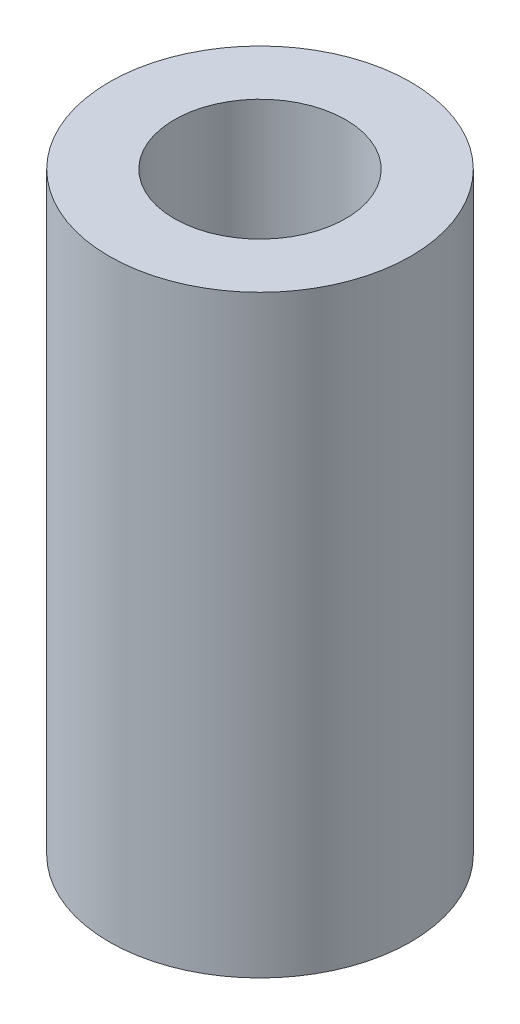
ISO-10303-21;
HEADER;
FILE_DESCRIPTION(('STEP AP214'),'2;1');
FILE_NAME('part.step','',(''),(''),'','','');
FILE_SCHEMA(('AUTOMOTIVE_DESIGN { 1 0 10303 214 1 1 1 1 }'));
ENDSEC;
DATA;
#1=APPLICATION_CONTEXT('core data for automotive mechanical design processes');
#2=APPLICATION_PROTOCOL_DEFINITION('international standard','automotive_design',2000,#1);
#3=PRODUCT_CONTEXT('',#1,'mechanical');
#4=PRODUCT('Part','Part','',(#3));
#5=PRODUCT_RELATED_PRODUCT_CATEGORY('part','',(#4));
#6=PRODUCT_DEFINITION_FORMATION('','',#4);
#7=PRODUCT_DEFINITION_CONTEXT('part definition',#1,'design');
#8=PRODUCT_DEFINITION('design','',#6,#7);
#9=PRODUCT_DEFINITION_SHAPE('','',#8);
#10=(LENGTH_UNIT() NAMED_UNIT(*) SI_UNIT(.MILLI.,.METRE.));
#11=(NAMED_UNIT(*) PLANE_ANGLE_UNIT() SI_UNIT($,.RADIAN.));
#12=(NAMED_UNIT(*) SI_UNIT($,.STERADIAN.) SOLID_ANGLE_UNIT());
#13=UNCERTAINTY_MEASURE_WITH_UNIT(LENGTH_MEASURE(1.E-05),#10,'distance_accuracy_value','');
#14=(GEOMETRIC_REPRESENTATION_CONTEXT(3) GLOBAL_UNCERTAINTY_ASSIGNED_CONTEXT((#13)) GLOBAL_UNIT_ASSIGNED_CONTEXT((#10,
#11,#12)) REPRESENTATION_CONTEXT('',''));
#15=CARTESIAN_POINT('',(0.,0.,0.));
#16=DIRECTION('',(0.,0.,1.));
#17=DIRECTION('',(1.,0.,0.));
#18=AXIS2_PLACEMENT_3D('',#15,#16,#17);
#19=CARTESIAN_POINT('',(0.,11.,0.));
#20=DIRECTION('',(0.,1.,0.));
#21=DIRECTION('',(0.,0.,1.));
#22=AXIS2_PLACEMENT_3D('',#19,#20,#21);
#23=PLANE('',#22);
#24=CARTESIAN_POINT('',(0.,11.,0.));
#25=DIRECTION('',(0.,1.,0.));
#26=DIRECTION('',(0.,0.,1.));
#27=AXIS2_PLACEMENT_3D('',#24,#25,#26);
#28=CIRCLE('',#27,2.794);
#29=CARTESIAN_POINT('',(0.,11.,2.794));
#30=VERTEX_POINT('',#29);
#31=EDGE_CURVE('E42',#30,#30,#28,.T.);
#32=ORIENTED_EDGE('',*,*,#31,.T.);
#33=EDGE_LOOP('',(#32));
#34=FACE_BOUND('',#33,.T.);
#35=CARTESIAN_POINT('',(0.,11.,0.));
#36=DIRECTION('',(0.,1.,0.));
#37=DIRECTION('',(0.,0.,1.));
#38=AXIS2_PLACEMENT_3D('',#35,#36,#37);
#39=CIRCLE('',#38,1.5875);
#40=CARTESIAN_POINT('',(0.,11.,1.5875));
#41=VERTEX_POINT('',#40);
#42=EDGE_CURVE('E50',#41,#41,#39,.T.);
#43=ORIENTED_EDGE('',*,*,#42,.F.);
#44=EDGE_LOOP('',(#43));
#45=FACE_BOUND('',#44,.T.);
#46=ADVANCED_FACE('F31',(#34,#45),#23,.T.);
#47=CARTESIAN_POINT('',(0.,0.,0.));
#48=DIRECTION('',(0.,1.,0.));
#49=DIRECTION('',(0.,0.,1.));
#50=AXIS2_PLACEMENT_3D('',#47,#48,#49);
#51=PLANE('',#50);
#52=CARTESIAN_POINT('',(0.,0.,0.));
#53=DIRECTION('',(0.,1.,0.));
#54=DIRECTION('',(0.,0.,1.));
#55=AXIS2_PLACEMENT_3D('',#52,#53,#54);
#56=CIRCLE('',#55,2.1828125);
#57=CARTESIAN_POINT('',(0.,0.,2.1828125));
#58=VERTEX_POINT('',#57);
#59=EDGE_CURVE('E38',#58,#58,#56,.T.);
#60=ORIENTED_EDGE('',*,*,#59,.T.);
#61=EDGE_LOOP('',(#60));
#62=FACE_BOUND('',#61,.T.);
#63=CARTESIAN_POINT('',(0.,0.,0.));
#64=DIRECTION('',(0.,1.,0.));
#65=DIRECTION('',(0.,0.,1.));
#66=AXIS2_PLACEMENT_3D('',#63,#64,#65);
#67=CIRCLE('',#66,2.794);
#68=CARTESIAN_POINT('',(0.,0.,2.794));
#69=VERTEX_POINT('',#68);
#70=EDGE_CURVE('E46',#69,#69,#67,.T.);
#71=ORIENTED_EDGE('',*,*,#70,.F.);
#72=EDGE_LOOP('',(#71));
#73=FACE_BOUND('',#72,.T.);
#74=ADVANCED_FACE('F58',(#62,#73),#51,.F.);
#75=CARTESIAN_POINT('',(0.,11.,0.));
#76=DIRECTION('',(0.,-1.,0.));
#77=DIRECTION('',(0.,0.,-1.));
#78=AXIS2_PLACEMENT_3D('',#75,#76,#77);
#79=CYLINDRICAL_SURFACE('',#78,2.794);
#80=ORIENTED_EDGE('',*,*,#31,.F.);
#81=EDGE_LOOP('',(#80));
#82=FACE_BOUND('',#81,.T.);
#83=ORIENTED_EDGE('',*,*,#70,.T.);
#84=EDGE_LOOP('',(#83));
#85=FACE_BOUND('',#84,.T.);
#86=ADVANCED_FACE('F64',(#82,#85),#79,.T.);
#87=CARTESIAN_POINT('',(0.,11.,0.));
#88=DIRECTION('',(0.,-1.,0.));
#89=DIRECTION('',(0.,0.,-1.));
#90=AXIS2_PLACEMENT_3D('',#87,#88,#89);
#91=CYLINDRICAL_SURFACE('',#90,1.5875);
#92=CARTESIAN_POINT('',(0.,0.5953125,0.));
#93=DIRECTION('',(0.,1.,0.));
#94=DIRECTION('',(0.,0.,1.));
#95=AXIS2_PLACEMENT_3D('',#92,#93,#94);
#96=CIRCLE('',#95,1.5875);
#97=CARTESIAN_POINT('',(0.,0.5953125,1.5875));
#98=VERTEX_POINT('',#97);
#99=EDGE_CURVE('E10',#98,#98,#96,.F.);
#100=ORIENTED_EDGE('',*,*,#99,.T.);
#101=EDGE_LOOP('',(#100));
#102=FACE_BOUND('',#101,.T.);
#103=ORIENTED_EDGE('',*,*,#42,.T.);
#104=EDGE_LOOP('',(#103));
#105=FACE_BOUND('',#104,.T.);
#106=ADVANCED_FACE('F55',(#102,#105),#91,.F.);
#107=CARTESIAN_POINT('',(0.,0.5953125,0.));
#108=DIRECTION('',(0.,1.,0.));
#109=DIRECTION('',(0.,0.,1.));
#110=AXIS2_PLACEMENT_3D('',#107,#108,#109);
#111=TOROIDAL_SURFACE('',#110,2.1828125,0.5953125);
#112=ORIENTED_EDGE('',*,*,#99,.F.);
#113=EDGE_LOOP('',(#112));
#114=FACE_BOUND('',#113,.T.);
#115=ORIENTED_EDGE('',*,*,#59,.F.);
#116=EDGE_LOOP('',(#115));
#117=FACE_BOUND('',#116,.T.);
#118=ADVANCED_FACE('F33',(#114,#117),#111,.T.);
#119=CLOSED_SHELL('',(#46,#74,#86,#106,#118));
#120=MANIFOLD_SOLID_BREP('B2',#119);
#121=ADVANCED_BREP_SHAPE_REPRESENTATION('',(#18,#120),#14);
#122=SHAPE_DEFINITION_REPRESENTATION(#9,#121);
ENDSEC;
END-ISO-10303-21;
